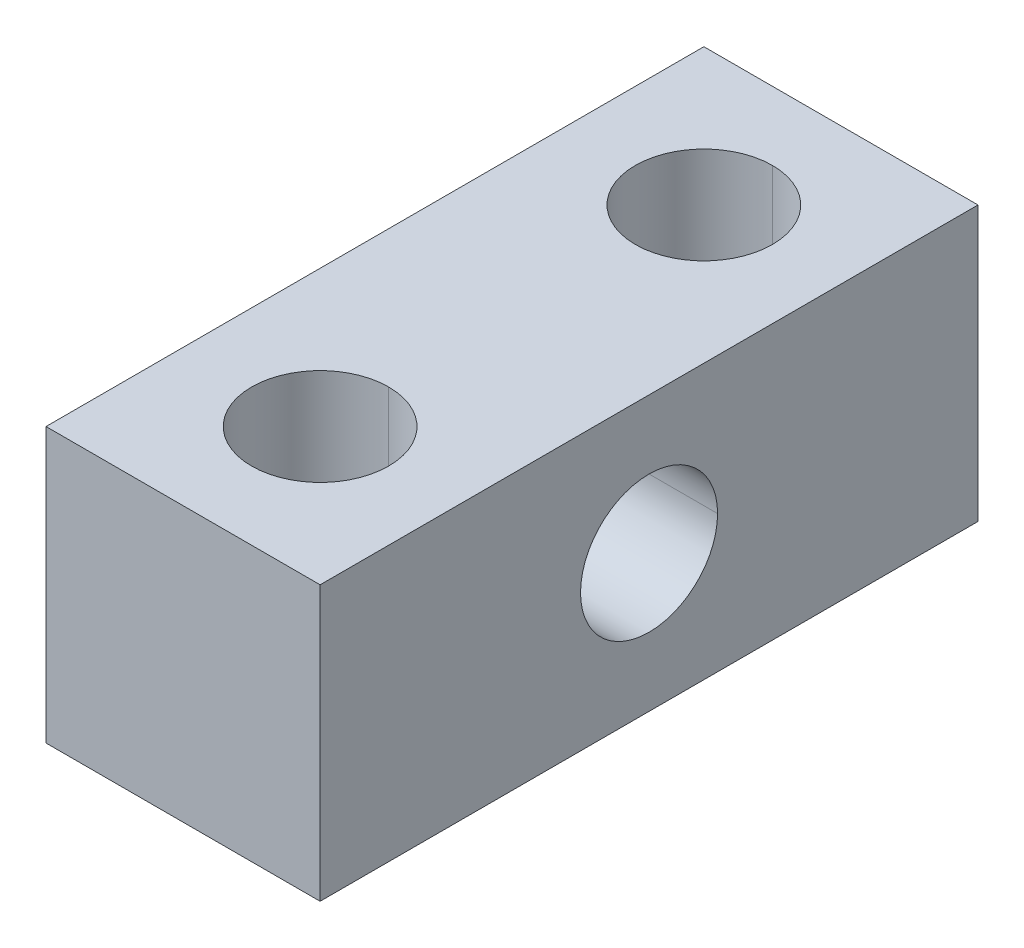
ISO-10303-21;
HEADER;
FILE_DESCRIPTION(('STEP AP214'),'2;1');
FILE_NAME('part.step','',(''),(''),'','','');
FILE_SCHEMA(('AUTOMOTIVE_DESIGN { 1 0 10303 214 1 1 1 1 }'));
ENDSEC;
DATA;
#1=APPLICATION_CONTEXT('core data for automotive mechanical design processes');
#2=APPLICATION_PROTOCOL_DEFINITION('international standard','automotive_design',2000,#1);
#3=PRODUCT_CONTEXT('',#1,'mechanical');
#4=PRODUCT('Part','Part','',(#3));
#5=PRODUCT_RELATED_PRODUCT_CATEGORY('part','',(#4));
#6=PRODUCT_DEFINITION_FORMATION('','',#4);
#7=PRODUCT_DEFINITION_CONTEXT('part definition',#1,'design');
#8=PRODUCT_DEFINITION('design','',#6,#7);
#9=PRODUCT_DEFINITION_SHAPE('','',#8);
#10=(LENGTH_UNIT() NAMED_UNIT(*) SI_UNIT(.MILLI.,.METRE.));
#11=(NAMED_UNIT(*) PLANE_ANGLE_UNIT() SI_UNIT($,.RADIAN.));
#12=(NAMED_UNIT(*) SI_UNIT($,.STERADIAN.) SOLID_ANGLE_UNIT());
#13=UNCERTAINTY_MEASURE_WITH_UNIT(LENGTH_MEASURE(1.E-05),#10,'distance_accuracy_value','');
#14=(GEOMETRIC_REPRESENTATION_CONTEXT(3) GLOBAL_UNCERTAINTY_ASSIGNED_CONTEXT((#13)) GLOBAL_UNIT_ASSIGNED_CONTEXT((#10,
#11,#12)) REPRESENTATION_CONTEXT('',''));
#15=CARTESIAN_POINT('',(0.,0.,0.));
#16=DIRECTION('',(0.,0.,1.));
#17=DIRECTION('',(1.,0.,0.));
#18=AXIS2_PLACEMENT_3D('',#15,#16,#17);
#19=CARTESIAN_POINT('',(2.5,0.,-6.));
#20=DIRECTION('',(1.,0.,0.));
#21=DIRECTION('',(0.,0.,-1.));
#22=AXIS2_PLACEMENT_3D('',#19,#20,#21);
#23=CYLINDRICAL_SURFACE('',#22,1.25);
#24=DIRECTION('',(1.,0.,0.));
#25=VECTOR('',#24,1.);
#26=CARTESIAN_POINT('',(2.5,0.,-4.75));
#27=LINE('',#26,#25);
#28=CARTESIAN_POINT('',(-2.5,0.,-4.75));
#29=VERTEX_POINT('',#28);
#30=CARTESIAN_POINT('',(2.5,0.,-4.75));
#31=VERTEX_POINT('',#30);
#32=EDGE_CURVE('E292',#29,#31,#27,.T.);
#33=ORIENTED_EDGE('',*,*,#32,.F.);
#34=CARTESIAN_POINT('',(-2.5,0.,-6.));
#35=DIRECTION('',(1.,0.,0.));
#36=DIRECTION('',(0.,0.,-1.));
#37=AXIS2_PLACEMENT_3D('',#34,#35,#36);
#38=CIRCLE('',#37,1.25);
#39=CARTESIAN_POINT('',(-2.5,0.,-7.25));
#40=VERTEX_POINT('',#39);
#41=EDGE_CURVE('E162',#40,#29,#38,.T.);
#42=ORIENTED_EDGE('',*,*,#41,.F.);
#43=DIRECTION('',(1.,0.,0.));
#44=VECTOR('',#43,1.);
#45=CARTESIAN_POINT('',(2.5,0.,-7.25));
#46=LINE('',#45,#44);
#47=CARTESIAN_POINT('',(2.5,0.,-7.25));
#48=VERTEX_POINT('',#47);
#49=EDGE_CURVE('E207',#40,#48,#46,.T.);
#50=ORIENTED_EDGE('',*,*,#49,.T.);
#51=CARTESIAN_POINT('',(2.5,0.,-6.));
#52=DIRECTION('',(1.,0.,0.));
#53=DIRECTION('',(0.,0.,-1.));
#54=AXIS2_PLACEMENT_3D('',#51,#52,#53);
#55=CIRCLE('',#54,1.25);
#56=EDGE_CURVE('E179',#48,#31,#55,.T.);
#57=ORIENTED_EDGE('',*,*,#56,.T.);
#58=EDGE_LOOP('',(#33,#42,#50,#57));
#59=FACE_BOUND('',#58,.T.);
#60=ADVANCED_FACE('F17',(#59),#23,.F.);
#61=CARTESIAN_POINT('',(0.,2.5,-2.5));
#62=DIRECTION('',(0.,1.,0.));
#63=DIRECTION('',(0.,0.,1.));
#64=AXIS2_PLACEMENT_3D('',#61,#62,#63);
#65=CYLINDRICAL_SURFACE('',#64,1.25);
#66=DIRECTION('',(0.,1.,0.));
#67=VECTOR('',#66,1.);
#68=CARTESIAN_POINT('',(0.,2.5,-3.75));
#69=LINE('',#68,#67);
#70=CARTESIAN_POINT('',(0.,-2.5,-3.75));
#71=VERTEX_POINT('',#70);
#72=CARTESIAN_POINT('',(0.,2.5,-3.75));
#73=VERTEX_POINT('',#72);
#74=EDGE_CURVE('E197',#71,#73,#69,.T.);
#75=ORIENTED_EDGE('',*,*,#74,.F.);
#76=CARTESIAN_POINT('',(0.,-2.5,-2.5));
#77=DIRECTION('',(0.,1.,0.));
#78=DIRECTION('',(0.,0.,1.));
#79=AXIS2_PLACEMENT_3D('',#76,#77,#78);
#80=CIRCLE('',#79,1.25);
#81=CARTESIAN_POINT('',(0.,-2.5,-1.25));
#82=VERTEX_POINT('',#81);
#83=EDGE_CURVE('E26',#82,#71,#80,.T.);
#84=ORIENTED_EDGE('',*,*,#83,.F.);
#85=DIRECTION('',(0.,1.,0.));
#86=VECTOR('',#85,1.);
#87=CARTESIAN_POINT('',(0.,2.5,-1.25));
#88=LINE('',#87,#86);
#89=CARTESIAN_POINT('',(0.,2.5,-1.25));
#90=VERTEX_POINT('',#89);
#91=EDGE_CURVE('E205',#82,#90,#88,.T.);
#92=ORIENTED_EDGE('',*,*,#91,.T.);
#93=CARTESIAN_POINT('',(0.,2.5,-2.5));
#94=DIRECTION('',(0.,1.,0.));
#95=DIRECTION('',(0.,0.,1.));
#96=AXIS2_PLACEMENT_3D('',#93,#94,#95);
#97=CIRCLE('',#96,1.25);
#98=EDGE_CURVE('E135',#90,#73,#97,.T.);
#99=ORIENTED_EDGE('',*,*,#98,.T.);
#100=EDGE_LOOP('',(#75,#84,#92,#99));
#101=FACE_BOUND('',#100,.T.);
#102=ADVANCED_FACE('F19',(#101),#65,.F.);
#103=CARTESIAN_POINT('',(0.,2.5,-9.5));
#104=DIRECTION('',(0.,1.,0.));
#105=DIRECTION('',(0.,0.,1.));
#106=AXIS2_PLACEMENT_3D('',#103,#104,#105);
#107=CYLINDRICAL_SURFACE('',#106,1.25);
#108=DIRECTION('',(0.,1.,0.));
#109=VECTOR('',#108,1.);
#110=CARTESIAN_POINT('',(0.,2.5,-10.75));
#111=LINE('',#110,#109);
#112=CARTESIAN_POINT('',(0.,-2.5,-10.75));
#113=VERTEX_POINT('',#112);
#114=CARTESIAN_POINT('',(0.,2.5,-10.75));
#115=VERTEX_POINT('',#114);
#116=EDGE_CURVE('E222',#113,#115,#111,.T.);
#117=ORIENTED_EDGE('',*,*,#116,.F.);
#118=CARTESIAN_POINT('',(0.,-2.5,-9.5));
#119=DIRECTION('',(0.,1.,0.));
#120=DIRECTION('',(0.,0.,1.));
#121=AXIS2_PLACEMENT_3D('',#118,#119,#120);
#122=CIRCLE('',#121,1.25);
#123=CARTESIAN_POINT('',(0.,-2.5,-8.25));
#124=VERTEX_POINT('',#123);
#125=EDGE_CURVE('E11',#124,#113,#122,.T.);
#126=ORIENTED_EDGE('',*,*,#125,.F.);
#127=DIRECTION('',(0.,1.,0.));
#128=VECTOR('',#127,1.);
#129=CARTESIAN_POINT('',(0.,2.5,-8.25));
#130=LINE('',#129,#128);
#131=CARTESIAN_POINT('',(0.,2.5,-8.25));
#132=VERTEX_POINT('',#131);
#133=EDGE_CURVE('E152',#124,#132,#130,.T.);
#134=ORIENTED_EDGE('',*,*,#133,.T.);
#135=CARTESIAN_POINT('',(0.,2.5,-9.5));
#136=DIRECTION('',(0.,1.,0.));
#137=DIRECTION('',(0.,0.,1.));
#138=AXIS2_PLACEMENT_3D('',#135,#136,#137);
#139=CIRCLE('',#138,1.25);
#140=EDGE_CURVE('E172',#132,#115,#139,.T.);
#141=ORIENTED_EDGE('',*,*,#140,.T.);
#142=EDGE_LOOP('',(#117,#126,#134,#141));
#143=FACE_BOUND('',#142,.T.);
#144=ADVANCED_FACE('F237',(#143),#107,.F.);
#145=CARTESIAN_POINT('',(-2.5,2.5,0.));
#146=DIRECTION('',(0.,0.,1.));
#147=DIRECTION('',(1.,0.,0.));
#148=AXIS2_PLACEMENT_3D('',#145,#146,#147);
#149=PLANE('',#148);
#150=DIRECTION('',(0.,-1.,0.));
#151=VECTOR('',#150,1.);
#152=CARTESIAN_POINT('',(-2.5,-2.5,0.));
#153=LINE('',#152,#151);
#154=CARTESIAN_POINT('',(-2.5,2.5,0.));
#155=VERTEX_POINT('',#154);
#156=CARTESIAN_POINT('',(-2.5,-2.5,0.));
#157=VERTEX_POINT('',#156);
#158=EDGE_CURVE('E146',#155,#157,#153,.T.);
#159=ORIENTED_EDGE('',*,*,#158,.T.);
#160=DIRECTION('',(1.,0.,0.));
#161=VECTOR('',#160,1.);
#162=CARTESIAN_POINT('',(2.5,-2.5,0.));
#163=LINE('',#162,#161);
#164=CARTESIAN_POINT('',(2.5,-2.5,0.));
#165=VERTEX_POINT('',#164);
#166=EDGE_CURVE('E50',#157,#165,#163,.T.);
#167=ORIENTED_EDGE('',*,*,#166,.T.);
#168=DIRECTION('',(0.,1.,0.));
#169=VECTOR('',#168,1.);
#170=CARTESIAN_POINT('',(2.5,-2.5,0.));
#171=LINE('',#170,#169);
#172=CARTESIAN_POINT('',(2.5,2.5,0.));
#173=VERTEX_POINT('',#172);
#174=EDGE_CURVE('E161',#165,#173,#171,.T.);
#175=ORIENTED_EDGE('',*,*,#174,.T.);
#176=DIRECTION('',(-1.,0.,0.));
#177=VECTOR('',#176,1.);
#178=CARTESIAN_POINT('',(2.5,2.5,0.));
#179=LINE('',#178,#177);
#180=EDGE_CURVE('E165',#173,#155,#179,.T.);
#181=ORIENTED_EDGE('',*,*,#180,.T.);
#182=EDGE_LOOP('',(#159,#167,#175,#181));
#183=FACE_BOUND('',#182,.T.);
#184=ADVANCED_FACE('F251',(#183),#149,.T.);
#185=CARTESIAN_POINT('',(-2.5,2.5,-12.));
#186=DIRECTION('',(0.,0.,1.));
#187=DIRECTION('',(1.,0.,0.));
#188=AXIS2_PLACEMENT_3D('',#185,#186,#187);
#189=PLANE('',#188);
#190=DIRECTION('',(0.,-1.,0.));
#191=VECTOR('',#190,1.);
#192=CARTESIAN_POINT('',(-2.5,-2.5,-12.));
#193=LINE('',#192,#191);
#194=CARTESIAN_POINT('',(-2.5,2.5,-12.));
#195=VERTEX_POINT('',#194);
#196=CARTESIAN_POINT('',(-2.5,-2.5,-12.));
#197=VERTEX_POINT('',#196);
#198=EDGE_CURVE('E138',#195,#197,#193,.T.);
#199=ORIENTED_EDGE('',*,*,#198,.F.);
#200=DIRECTION('',(-1.,0.,0.));
#201=VECTOR('',#200,1.);
#202=CARTESIAN_POINT('',(2.5,2.5,-12.));
#203=LINE('',#202,#201);
#204=CARTESIAN_POINT('',(2.5,2.5,-12.));
#205=VERTEX_POINT('',#204);
#206=EDGE_CURVE('E124',#205,#195,#203,.T.);
#207=ORIENTED_EDGE('',*,*,#206,.F.);
#208=DIRECTION('',(0.,1.,0.));
#209=VECTOR('',#208,1.);
#210=CARTESIAN_POINT('',(2.5,-2.5,-12.));
#211=LINE('',#210,#209);
#212=CARTESIAN_POINT('',(2.5,-2.5,-12.));
#213=VERTEX_POINT('',#212);
#214=EDGE_CURVE('E160',#213,#205,#211,.T.);
#215=ORIENTED_EDGE('',*,*,#214,.F.);
#216=DIRECTION('',(1.,0.,0.));
#217=VECTOR('',#216,1.);
#218=CARTESIAN_POINT('',(2.5,-2.5,-12.));
#219=LINE('',#218,#217);
#220=EDGE_CURVE('E39',#197,#213,#219,.T.);
#221=ORIENTED_EDGE('',*,*,#220,.F.);
#222=EDGE_LOOP('',(#199,#207,#215,#221));
#223=FACE_BOUND('',#222,.T.);
#224=ADVANCED_FACE('F139',(#223),#189,.F.);
#225=CARTESIAN_POINT('',(2.5,-2.5,-12.));
#226=DIRECTION('',(0.,-1.,0.));
#227=DIRECTION('',(0.,0.,-1.));
#228=AXIS2_PLACEMENT_3D('',#225,#226,#227);
#229=PLANE('',#228);
#230=ORIENTED_EDGE('',*,*,#125,.T.);
#231=CARTESIAN_POINT('',(0.,-2.5,-9.5));
#232=DIRECTION('',(0.,1.,0.));
#233=DIRECTION('',(0.,0.,1.));
#234=AXIS2_PLACEMENT_3D('',#231,#232,#233);
#235=CIRCLE('',#234,1.25);
#236=EDGE_CURVE('E218',#113,#124,#235,.T.);
#237=ORIENTED_EDGE('',*,*,#236,.T.);
#238=EDGE_LOOP('',(#230,#237));
#239=FACE_BOUND('',#238,.T.);
#240=ORIENTED_EDGE('',*,*,#83,.T.);
#241=CARTESIAN_POINT('',(0.,-2.5,-2.5));
#242=DIRECTION('',(0.,1.,0.));
#243=DIRECTION('',(0.,0.,1.));
#244=AXIS2_PLACEMENT_3D('',#241,#242,#243);
#245=CIRCLE('',#244,1.25);
#246=EDGE_CURVE('E192',#71,#82,#245,.T.);
#247=ORIENTED_EDGE('',*,*,#246,.T.);
#248=EDGE_LOOP('',(#240,#247));
#249=FACE_BOUND('',#248,.T.);
#250=ORIENTED_EDGE('',*,*,#166,.F.);
#251=DIRECTION('',(0.,0.,1.));
#252=VECTOR('',#251,1.);
#253=CARTESIAN_POINT('',(-2.5,-2.5,-12.));
#254=LINE('',#253,#252);
#255=EDGE_CURVE('E143',#197,#157,#254,.T.);
#256=ORIENTED_EDGE('',*,*,#255,.F.);
#257=ORIENTED_EDGE('',*,*,#220,.T.);
#258=DIRECTION('',(0.,0.,1.));
#259=VECTOR('',#258,1.);
#260=CARTESIAN_POINT('',(2.5,-2.5,-12.));
#261=LINE('',#260,#259);
#262=EDGE_CURVE('E157',#213,#165,#261,.T.);
#263=ORIENTED_EDGE('',*,*,#262,.T.);
#264=EDGE_LOOP('',(#250,#256,#257,#263));
#265=FACE_BOUND('',#264,.T.);
#266=ADVANCED_FACE('F190',(#239,#249,#265),#229,.T.);
#267=CARTESIAN_POINT('',(2.5,-2.5,-12.));
#268=DIRECTION('',(1.,0.,0.));
#269=DIRECTION('',(0.,1.,0.));
#270=AXIS2_PLACEMENT_3D('',#267,#268,#269);
#271=PLANE('',#270);
#272=ORIENTED_EDGE('',*,*,#56,.F.);
#273=CARTESIAN_POINT('',(2.5,0.,-6.));
#274=DIRECTION('',(1.,0.,0.));
#275=DIRECTION('',(0.,0.,-1.));
#276=AXIS2_PLACEMENT_3D('',#273,#274,#275);
#277=CIRCLE('',#276,1.25);
#278=EDGE_CURVE('E212',#31,#48,#277,.T.);
#279=ORIENTED_EDGE('',*,*,#278,.F.);
#280=EDGE_LOOP('',(#272,#279));
#281=FACE_BOUND('',#280,.T.);
#282=ORIENTED_EDGE('',*,*,#174,.F.);
#283=ORIENTED_EDGE('',*,*,#262,.F.);
#284=ORIENTED_EDGE('',*,*,#214,.T.);
#285=DIRECTION('',(0.,0.,1.));
#286=VECTOR('',#285,1.);
#287=CARTESIAN_POINT('',(2.5,2.5,-12.));
#288=LINE('',#287,#286);
#289=EDGE_CURVE('E132',#205,#173,#288,.T.);
#290=ORIENTED_EDGE('',*,*,#289,.T.);
#291=EDGE_LOOP('',(#282,#283,#284,#290));
#292=FACE_BOUND('',#291,.T.);
#293=ADVANCED_FACE('F242',(#281,#292),#271,.T.);
#294=CARTESIAN_POINT('',(2.5,2.5,-12.));
#295=DIRECTION('',(0.,1.,0.));
#296=DIRECTION('',(1.,0.,0.));
#297=AXIS2_PLACEMENT_3D('',#294,#295,#296);
#298=PLANE('',#297);
#299=ORIENTED_EDGE('',*,*,#140,.F.);
#300=CARTESIAN_POINT('',(0.,2.5,-9.5));
#301=DIRECTION('',(0.,1.,0.));
#302=DIRECTION('',(0.,0.,1.));
#303=AXIS2_PLACEMENT_3D('',#300,#301,#302);
#304=CIRCLE('',#303,1.25);
#305=EDGE_CURVE('E225',#115,#132,#304,.T.);
#306=ORIENTED_EDGE('',*,*,#305,.F.);
#307=EDGE_LOOP('',(#299,#306));
#308=FACE_BOUND('',#307,.T.);
#309=ORIENTED_EDGE('',*,*,#98,.F.);
#310=CARTESIAN_POINT('',(0.,2.5,-2.5));
#311=DIRECTION('',(0.,1.,0.));
#312=DIRECTION('',(0.,0.,1.));
#313=AXIS2_PLACEMENT_3D('',#310,#311,#312);
#314=CIRCLE('',#313,1.25);
#315=EDGE_CURVE('E202',#73,#90,#314,.T.);
#316=ORIENTED_EDGE('',*,*,#315,.F.);
#317=EDGE_LOOP('',(#309,#316));
#318=FACE_BOUND('',#317,.T.);
#319=ORIENTED_EDGE('',*,*,#180,.F.);
#320=ORIENTED_EDGE('',*,*,#289,.F.);
#321=ORIENTED_EDGE('',*,*,#206,.T.);
#322=DIRECTION('',(0.,0.,1.));
#323=VECTOR('',#322,1.);
#324=CARTESIAN_POINT('',(-2.5,2.5,-12.));
#325=LINE('',#324,#323);
#326=EDGE_CURVE('E129',#195,#155,#325,.T.);
#327=ORIENTED_EDGE('',*,*,#326,.T.);
#328=EDGE_LOOP('',(#319,#320,#321,#327));
#329=FACE_BOUND('',#328,.T.);
#330=ADVANCED_FACE('F127',(#308,#318,#329),#298,.T.);
#331=CARTESIAN_POINT('',(-2.5,-2.5,-12.));
#332=DIRECTION('',(-1.,0.,0.));
#333=DIRECTION('',(0.,0.,1.));
#334=AXIS2_PLACEMENT_3D('',#331,#332,#333);
#335=PLANE('',#334);
#336=ORIENTED_EDGE('',*,*,#41,.T.);
#337=CARTESIAN_POINT('',(-2.5,0.,-6.));
#338=DIRECTION('',(1.,0.,0.));
#339=DIRECTION('',(0.,0.,-1.));
#340=AXIS2_PLACEMENT_3D('',#337,#338,#339);
#341=CIRCLE('',#340,1.25);
#342=EDGE_CURVE('E297',#29,#40,#341,.T.);
#343=ORIENTED_EDGE('',*,*,#342,.T.);
#344=EDGE_LOOP('',(#336,#343));
#345=FACE_BOUND('',#344,.T.);
#346=ORIENTED_EDGE('',*,*,#158,.F.);
#347=ORIENTED_EDGE('',*,*,#326,.F.);
#348=ORIENTED_EDGE('',*,*,#198,.T.);
#349=ORIENTED_EDGE('',*,*,#255,.T.);
#350=EDGE_LOOP('',(#346,#347,#348,#349));
#351=FACE_BOUND('',#350,.T.);
#352=ADVANCED_FACE('F145',(#345,#351),#335,.T.);
#353=CARTESIAN_POINT('',(0.,2.5,-9.5));
#354=DIRECTION('',(0.,1.,0.));
#355=DIRECTION('',(0.,0.,1.));
#356=AXIS2_PLACEMENT_3D('',#353,#354,#355);
#357=CYLINDRICAL_SURFACE('',#356,1.25);
#358=ORIENTED_EDGE('',*,*,#236,.F.);
#359=ORIENTED_EDGE('',*,*,#116,.T.);
#360=ORIENTED_EDGE('',*,*,#305,.T.);
#361=ORIENTED_EDGE('',*,*,#133,.F.);
#362=EDGE_LOOP('',(#358,#359,#360,#361));
#363=FACE_BOUND('',#362,.T.);
#364=ADVANCED_FACE('F239',(#363),#357,.F.);
#365=CARTESIAN_POINT('',(0.,2.5,-2.5));
#366=DIRECTION('',(0.,1.,0.));
#367=DIRECTION('',(0.,0.,1.));
#368=AXIS2_PLACEMENT_3D('',#365,#366,#367);
#369=CYLINDRICAL_SURFACE('',#368,1.25);
#370=ORIENTED_EDGE('',*,*,#246,.F.);
#371=ORIENTED_EDGE('',*,*,#74,.T.);
#372=ORIENTED_EDGE('',*,*,#315,.T.);
#373=ORIENTED_EDGE('',*,*,#91,.F.);
#374=EDGE_LOOP('',(#370,#371,#372,#373));
#375=FACE_BOUND('',#374,.T.);
#376=ADVANCED_FACE('F204',(#375),#369,.F.);
#377=CARTESIAN_POINT('',(2.5,0.,-6.));
#378=DIRECTION('',(1.,0.,0.));
#379=DIRECTION('',(0.,0.,-1.));
#380=AXIS2_PLACEMENT_3D('',#377,#378,#379);
#381=CYLINDRICAL_SURFACE('',#380,1.25);
#382=ORIENTED_EDGE('',*,*,#342,.F.);
#383=ORIENTED_EDGE('',*,*,#32,.T.);
#384=ORIENTED_EDGE('',*,*,#278,.T.);
#385=ORIENTED_EDGE('',*,*,#49,.F.);
#386=EDGE_LOOP('',(#382,#383,#384,#385));
#387=FACE_BOUND('',#386,.T.);
#388=ADVANCED_FACE('F265',(#387),#381,.F.);
#389=CLOSED_SHELL('',(#60,#102,#144,#184,#224,#266,#293,#330,#352,#364,#376,#388));
#390=MANIFOLD_SOLID_BREP('B1',#389);
#391=ADVANCED_BREP_SHAPE_REPRESENTATION('',(#18,#390),#14);
#392=SHAPE_DEFINITION_REPRESENTATION(#9,#391);
ENDSEC;
END-ISO-10303-21;
